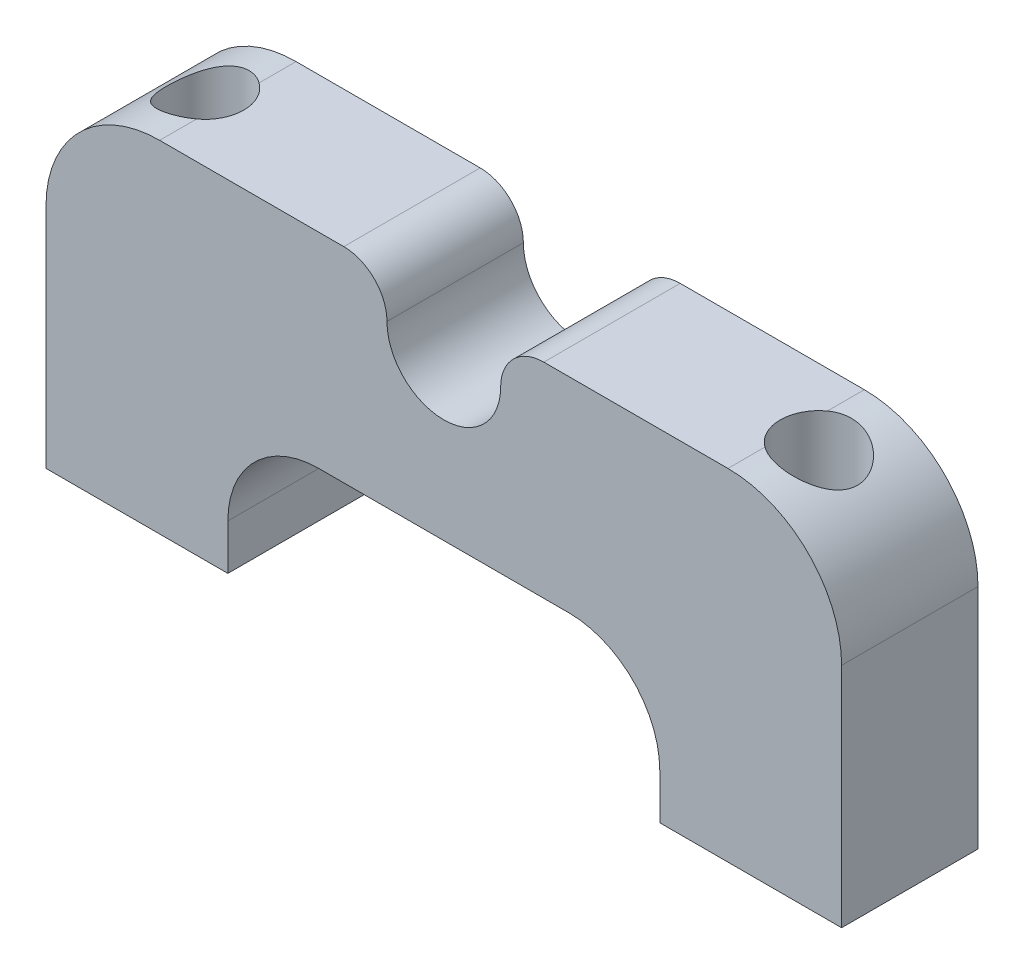
ISO-10303-21;
HEADER;
FILE_DESCRIPTION(('STEP AP214'),'2;1');
FILE_NAME('part.step','',(''),(''),'','','');
FILE_SCHEMA(('AUTOMOTIVE_DESIGN { 1 0 10303 214 1 1 1 1 }'));
ENDSEC;
DATA;
#1=APPLICATION_CONTEXT('core data for automotive mechanical design processes');
#2=APPLICATION_PROTOCOL_DEFINITION('international standard','automotive_design',2000,#1);
#3=PRODUCT_CONTEXT('',#1,'mechanical');
#4=PRODUCT('Part','Part','',(#3));
#5=PRODUCT_RELATED_PRODUCT_CATEGORY('part','',(#4));
#6=PRODUCT_DEFINITION_FORMATION('','',#4);
#7=PRODUCT_DEFINITION_CONTEXT('part definition',#1,'design');
#8=PRODUCT_DEFINITION('design','',#6,#7);
#9=PRODUCT_DEFINITION_SHAPE('','',#8);
#10=(LENGTH_UNIT() NAMED_UNIT(*) SI_UNIT(.MILLI.,.METRE.));
#11=(NAMED_UNIT(*) PLANE_ANGLE_UNIT() SI_UNIT($,.RADIAN.));
#12=(NAMED_UNIT(*) SI_UNIT($,.STERADIAN.) SOLID_ANGLE_UNIT());
#13=UNCERTAINTY_MEASURE_WITH_UNIT(LENGTH_MEASURE(1.E-05),#10,'distance_accuracy_value','');
#14=(GEOMETRIC_REPRESENTATION_CONTEXT(3) GLOBAL_UNCERTAINTY_ASSIGNED_CONTEXT((#13)) GLOBAL_UNIT_ASSIGNED_CONTEXT((#10,
#11,#12)) REPRESENTATION_CONTEXT('',''));
#15=CARTESIAN_POINT('',(0.,0.,0.));
#16=DIRECTION('',(0.,0.,1.));
#17=DIRECTION('',(1.,0.,0.));
#18=AXIS2_PLACEMENT_3D('',#15,#16,#17);
#19=CARTESIAN_POINT('',(8.75,-3.75,3.));
#20=DIRECTION('',(-1.,0.,0.));
#21=DIRECTION('',(0.,0.,1.));
#22=AXIS2_PLACEMENT_3D('',#19,#20,#21);
#23=PLANE('',#22);
#24=DIRECTION('',(0.,1.,0.));
#25=VECTOR('',#24,1.);
#26=CARTESIAN_POINT('',(8.75,-3.75,0.));
#27=LINE('',#26,#25);
#28=CARTESIAN_POINT('',(8.75,-3.75,0.));
#29=VERTEX_POINT('',#28);
#30=CARTESIAN_POINT('',(8.75,1.24999999999998,0.));
#31=VERTEX_POINT('',#30);
#32=EDGE_CURVE('E286',#29,#31,#27,.T.);
#33=ORIENTED_EDGE('',*,*,#32,.T.);
#34=DIRECTION('',(0.,0.,-1.));
#35=VECTOR('',#34,1.);
#36=CARTESIAN_POINT('',(8.75,1.24999999999998,3.));
#37=LINE('',#36,#35);
#38=CARTESIAN_POINT('',(8.75,1.24999999999998,3.));
#39=VERTEX_POINT('',#38);
#40=EDGE_CURVE('E200',#39,#31,#37,.T.);
#41=ORIENTED_EDGE('',*,*,#40,.F.);
#42=DIRECTION('',(0.,1.,0.));
#43=VECTOR('',#42,1.);
#44=CARTESIAN_POINT('',(8.75,-3.75,3.));
#45=LINE('',#44,#43);
#46=CARTESIAN_POINT('',(8.75,-3.75,3.));
#47=VERTEX_POINT('',#46);
#48=EDGE_CURVE('E329',#47,#39,#45,.T.);
#49=ORIENTED_EDGE('',*,*,#48,.F.);
#50=DIRECTION('',(0.,0.,-1.));
#51=VECTOR('',#50,1.);
#52=CARTESIAN_POINT('',(8.75,-3.75,3.));
#53=LINE('',#52,#51);
#54=EDGE_CURVE('E289',#47,#29,#53,.T.);
#55=ORIENTED_EDGE('',*,*,#54,.T.);
#56=EDGE_LOOP('',(#33,#41,#49,#55));
#57=FACE_BOUND('',#56,.T.);
#58=ADVANCED_FACE('F36',(#57),#23,.F.);
#59=CARTESIAN_POINT('',(6.25,1.25,3.));
#60=DIRECTION('',(0.,0.,-1.));
#61=DIRECTION('',(-1.,0.,0.));
#62=AXIS2_PLACEMENT_3D('',#59,#60,#61);
#63=CYLINDRICAL_SURFACE('',#62,2.5);
#64=DIRECTION('',(0.,0.,-1.));
#65=VECTOR('',#64,1.);
#66=CARTESIAN_POINT('',(6.24999999999998,3.75,3.));
#67=LINE('',#66,#65);
#68=CARTESIAN_POINT('',(6.25,3.75,0.812613645756626));
#69=VERTEX_POINT('',#68);
#70=CARTESIAN_POINT('',(6.24999999999998,3.75,0.));
#71=VERTEX_POINT('',#70);
#72=EDGE_CURVE('E196',#69,#71,#67,.T.);
#73=ORIENTED_EDGE('',*,*,#72,.F.);
#74=CARTESIAN_POINT('',(6.24999999999998,3.75,0.812613645756639));
#75=CARTESIAN_POINT('',(6.26860133412248,3.750000458947,0.799083008749802));
#76=CARTESIAN_POINT('',(6.28774447366208,3.74979206957645,0.78631399960251));
#77=CARTESIAN_POINT('',(6.32699426706544,3.74889125925356,0.762371939662228));
#78=CARTESIAN_POINT('',(6.34710097016077,3.7481988135446,0.751198970532428));
#79=CARTESIAN_POINT('',(6.40859391090567,3.74530012057646,0.720230178476046));
#80=CARTESIAN_POINT('',(6.45123506190468,3.74227309205735,0.702924914235687));
#81=CARTESIAN_POINT('',(6.53853853792758,3.73368127122221,0.675449657813136));
#82=CARTESIAN_POINT('',(6.58320286374509,3.72811391505039,0.66528690067766));
#83=CARTESIAN_POINT('',(6.67316989303669,3.71434501302801,0.652260791392417));
#84=CARTESIAN_POINT('',(6.71847240464708,3.7061442433805,0.649395290583925));
#85=CARTESIAN_POINT('',(6.80845830535242,3.68726084093931,0.650818034799965));
#86=CARTESIAN_POINT('',(6.85314129089804,3.67657666420299,0.655110740398517));
#87=CARTESIAN_POINT('',(6.94075669264475,3.65310531401902,0.670486686444462));
#88=CARTESIAN_POINT('',(6.98368823788299,3.64031710980484,0.681573262509686));
#89=CARTESIAN_POINT('',(7.06932880928035,3.61238156423578,0.710888589805132));
#90=CARTESIAN_POINT('',(7.11187571435693,3.59713962237322,0.729499637667582));
#91=CARTESIAN_POINT('',(7.1931250883493,3.56568914402077,0.773178182779638));
#92=CARTESIAN_POINT('',(7.23182606302024,3.54948023572287,0.798248176013787));
#93=CARTESIAN_POINT('',(7.30760560045878,3.51568444933086,0.856539775070852));
#94=CARTESIAN_POINT('',(7.34430342876685,3.49809157874233,0.890254778816378));
#95=CARTESIAN_POINT('',(7.41152811601018,3.46410788475755,0.96393235151555));
#96=CARTESIAN_POINT('',(7.44205174257271,3.44771769384524,1.00389817363914));
#97=CARTESIAN_POINT('',(7.49597349706725,3.41760393671702,1.08941367056501));
#98=CARTESIAN_POINT('',(7.51936090682466,3.40388439273398,1.13497160188311));
#99=CARTESIAN_POINT('',(7.55777445407831,3.38078284270151,1.23048597401679));
#100=CARTESIAN_POINT('',(7.57281483822758,3.37139345063459,1.28043475067022));
#101=CARTESIAN_POINT('',(7.59215594902143,3.35920144511412,1.37617081952253));
#102=CARTESIAN_POINT('',(7.59761495613544,3.35569133344911,1.42163349664168));
#103=CARTESIAN_POINT('',(7.60112606581426,3.35344122488716,1.51295285713064));
#104=CARTESIAN_POINT('',(7.59918269904735,3.35469831019603,1.55880928235985));
#105=CARTESIAN_POINT('',(7.58866455782104,3.36139927615017,1.64416007695867));
#106=CARTESIAN_POINT('',(7.58085661859316,3.36635863125548,1.68379191738784));
#107=CARTESIAN_POINT('',(7.55990347366423,3.37939055299157,1.76107471423333));
#108=CARTESIAN_POINT('',(7.54675697454936,3.38746387404296,1.79872518810998));
#109=CARTESIAN_POINT('',(7.51476885100089,3.40655361920219,1.87331794603312));
#110=CARTESIAN_POINT('',(7.49565265999665,3.41770802545482,1.91010612464368));
#111=CARTESIAN_POINT('',(7.45263585055003,3.44186573454314,1.98009631980471));
#112=CARTESIAN_POINT('',(7.42873291218911,3.45486993300018,2.01329658539767));
#113=CARTESIAN_POINT('',(7.37288031350231,3.48389050000698,2.0802471419617));
#114=CARTESIAN_POINT('',(7.34026574219057,3.50006973465675,2.11337339598548));
#115=CARTESIAN_POINT('',(7.27016403014479,3.53270934429794,2.17385064158631));
#116=CARTESIAN_POINT('',(7.23267394243239,3.54916988405311,2.20119811375466));
#117=CARTESIAN_POINT('',(7.14999135409407,3.58284751448357,2.2517019791982));
#118=CARTESIAN_POINT('',(7.10441036160618,3.6000016888383,2.27426930823073));
#119=CARTESIAN_POINT('',(7.00936157191337,3.63241208728115,2.31106473076521));
#120=CARTESIAN_POINT('',(6.95989476594483,3.64766879284794,2.32529494320761));
#121=CARTESIAN_POINT('',(6.86026613084888,3.67490094127643,2.34428599606073));
#122=CARTESIAN_POINT('',(6.81019328577165,3.68697466211033,2.34936900219388));
#123=CARTESIAN_POINT('',(6.7092839218702,3.70798869094631,2.35051941847204));
#124=CARTESIAN_POINT('',(6.65844774428526,3.71693035801989,2.34659074459636));
#125=CARTESIAN_POINT('',(6.56202351304686,3.73089114423223,2.33027562493094));
#126=CARTESIAN_POINT('',(6.51634893400191,3.73617335718952,2.31861496129235));
#127=CARTESIAN_POINT('',(6.42738619623757,3.7440976344157,2.28780011872209));
#128=CARTESIAN_POINT('',(6.3840951893759,3.74674291722218,2.26865511474758));
#129=CARTESIAN_POINT('',(6.32663462972008,3.74887758102337,2.23729199762628));
#130=CARTESIAN_POINT('',(6.31084411516351,3.74930764306688,2.22799626648231));
#131=CARTESIAN_POINT('',(6.27992335654751,3.74986841645679,2.2084215747894));
#132=CARTESIAN_POINT('',(6.26479185405823,3.7499997253082,2.19814461967824));
#133=CARTESIAN_POINT('',(6.24999999999998,3.75000000000001,2.18738635424337));
#134=B_SPLINE_CURVE_WITH_KNOTS('',3,(#74,#75,#76,#77,#78,#79,#80,#81,#82,#83,#84,#85,#86,#87,
#88,#89,#90,#91,#92,#93,#94,#95,#96,#97,#98,#99,#100,#101,#102,#103,#104,#105,#106,#107,#108,
#109,#110,#111,#112,#113,#114,#115,#116,#117,#118,#119,#120,#121,#122,#123,#124,#125,#126,#127,
#128,#129,#130,#131,#132,#133),.UNSPECIFIED.,.F.,.F.,(4,2,2,2,2,2,2,2,2,2,2,2,2,2,2,2,2,2,2,2,2,
2,2,2,2,2,2,2,2,4),(0.,0.0689655108109783,0.137934549057316,0.275572242505809,0.413349156739533,
0.551085498215195,0.688907700970909,0.826797625202506,0.972811254821336,1.1188813945704,
1.2766978680798,1.43459675043611,1.59273163327078,1.7505957757789,1.88755860908909,
2.02443762693215,2.14599123134418,2.26757430306655,2.39587602621132,2.52424008251001,
2.67129811573712,2.81844545413204,2.97867978970071,3.13887338282959,3.29330549445785,
3.447670511118,3.58927877713508,3.73071398902591,3.78566807732178,3.84051216071743),.UNSPECIFIED.);
#135=CARTESIAN_POINT('',(6.24999999999998,3.75,2.18738635424336));
#136=VERTEX_POINT('',#135);
#137=EDGE_CURVE('E48',#69,#136,#134,.T.);
#138=ORIENTED_EDGE('',*,*,#137,.T.);
#139=CARTESIAN_POINT('',(6.24999999999998,3.75,3.));
#140=VERTEX_POINT('',#139);
#141=EDGE_CURVE('E197',#140,#136,#67,.T.);
#142=ORIENTED_EDGE('',*,*,#141,.F.);
#143=CARTESIAN_POINT('',(6.25,1.25,3.));
#144=DIRECTION('',(0.,0.,1.));
#145=DIRECTION('',(1.,0.,0.));
#146=AXIS2_PLACEMENT_3D('',#143,#144,#145);
#147=CIRCLE('',#146,2.5);
#148=EDGE_CURVE('E383',#39,#140,#147,.T.);
#149=ORIENTED_EDGE('',*,*,#148,.F.);
#150=ORIENTED_EDGE('',*,*,#40,.T.);
#151=CARTESIAN_POINT('',(6.25,1.25,0.));
#152=DIRECTION('',(0.,0.,1.));
#153=DIRECTION('',(1.,0.,0.));
#154=AXIS2_PLACEMENT_3D('',#151,#152,#153);
#155=CIRCLE('',#154,2.5);
#156=EDGE_CURVE('E291',#31,#71,#155,.T.);
#157=ORIENTED_EDGE('',*,*,#156,.T.);
#158=EDGE_LOOP('',(#73,#138,#142,#149,#150,#157));
#159=FACE_BOUND('',#158,.T.);
#160=ADVANCED_FACE('F206',(#159),#63,.T.);
#161=CARTESIAN_POINT('',(6.24999999999998,3.75,3.));
#162=DIRECTION('',(0.,-1.,0.));
#163=DIRECTION('',(1.,0.,0.));
#164=AXIS2_PLACEMENT_3D('',#161,#162,#163);
#165=PLANE('',#164);
#166=ORIENTED_EDGE('',*,*,#141,.T.);
#167=CARTESIAN_POINT('',(6.75,3.75,1.5));
#168=DIRECTION('',(0.,-1.,0.));
#169=DIRECTION('',(0.,0.,-1.));
#170=AXIS2_PLACEMENT_3D('',#167,#168,#169);
#171=CIRCLE('',#170,0.849999999999998);
#172=EDGE_CURVE('E60',#136,#69,#171,.T.);
#173=ORIENTED_EDGE('',*,*,#172,.T.);
#174=ORIENTED_EDGE('',*,*,#72,.T.);
#175=DIRECTION('',(-1.,0.,0.));
#176=VECTOR('',#175,1.);
#177=CARTESIAN_POINT('',(6.24999999999998,3.75,0.));
#178=LINE('',#177,#176);
#179=CARTESIAN_POINT('',(2.2,3.75,0.));
#180=VERTEX_POINT('',#179);
#181=EDGE_CURVE('E294',#71,#180,#178,.T.);
#182=ORIENTED_EDGE('',*,*,#181,.T.);
#183=DIRECTION('',(0.,0.,-1.));
#184=VECTOR('',#183,1.);
#185=CARTESIAN_POINT('',(2.2,3.75,3.));
#186=LINE('',#185,#184);
#187=CARTESIAN_POINT('',(2.2,3.75,3.));
#188=VERTEX_POINT('',#187);
#189=EDGE_CURVE('E193',#188,#180,#186,.T.);
#190=ORIENTED_EDGE('',*,*,#189,.F.);
#191=DIRECTION('',(-1.,0.,0.));
#192=VECTOR('',#191,1.);
#193=CARTESIAN_POINT('',(6.24999999999998,3.75,3.));
#194=LINE('',#193,#192);
#195=EDGE_CURVE('E385',#140,#188,#194,.T.);
#196=ORIENTED_EDGE('',*,*,#195,.F.);
#197=EDGE_LOOP('',(#166,#173,#174,#182,#190,#196));
#198=FACE_BOUND('',#197,.T.);
#199=ADVANCED_FACE('F270',(#198),#165,.F.);
#200=CARTESIAN_POINT('',(2.2,2.8,3.));
#201=DIRECTION('',(0.,0.,-1.));
#202=DIRECTION('',(-1.,0.,0.));
#203=AXIS2_PLACEMENT_3D('',#200,#201,#202);
#204=CYLINDRICAL_SURFACE('',#203,0.95);
#205=CARTESIAN_POINT('',(2.2,2.8,0.));
#206=DIRECTION('',(0.,0.,1.));
#207=DIRECTION('',(-1.,0.,0.));
#208=AXIS2_PLACEMENT_3D('',#205,#206,#207);
#209=CIRCLE('',#208,0.95);
#210=CARTESIAN_POINT('',(1.25,2.8,0.));
#211=VERTEX_POINT('',#210);
#212=EDGE_CURVE('E303',#180,#211,#209,.T.);
#213=ORIENTED_EDGE('',*,*,#212,.T.);
#214=DIRECTION('',(0.,0.,-1.));
#215=VECTOR('',#214,1.);
#216=CARTESIAN_POINT('',(1.25,2.8,3.));
#217=LINE('',#216,#215);
#218=CARTESIAN_POINT('',(1.25,2.8,3.));
#219=VERTEX_POINT('',#218);
#220=EDGE_CURVE('E190',#219,#211,#217,.T.);
#221=ORIENTED_EDGE('',*,*,#220,.F.);
#222=CARTESIAN_POINT('',(2.2,2.8,3.));
#223=DIRECTION('',(0.,0.,1.));
#224=DIRECTION('',(-1.,0.,0.));
#225=AXIS2_PLACEMENT_3D('',#222,#223,#224);
#226=CIRCLE('',#225,0.95);
#227=EDGE_CURVE('E390',#188,#219,#226,.T.);
#228=ORIENTED_EDGE('',*,*,#227,.F.);
#229=ORIENTED_EDGE('',*,*,#189,.T.);
#230=EDGE_LOOP('',(#213,#221,#228,#229));
#231=FACE_BOUND('',#230,.T.);
#232=ADVANCED_FACE('F267',(#231),#204,.T.);
#233=CARTESIAN_POINT('',(0.,2.8,3.));
#234=DIRECTION('',(0.,0.,-1.));
#235=DIRECTION('',(-1.,0.,0.));
#236=AXIS2_PLACEMENT_3D('',#233,#234,#235);
#237=CYLINDRICAL_SURFACE('',#236,1.25);
#238=CARTESIAN_POINT('',(0.,2.8,0.));
#239=DIRECTION('',(0.,0.,-1.));
#240=DIRECTION('',(1.,0.,0.));
#241=AXIS2_PLACEMENT_3D('',#238,#239,#240);
#242=CIRCLE('',#241,1.25);
#243=CARTESIAN_POINT('',(-1.25,2.8,0.));
#244=VERTEX_POINT('',#243);
#245=EDGE_CURVE('E305',#211,#244,#242,.T.);
#246=ORIENTED_EDGE('',*,*,#245,.T.);
#247=DIRECTION('',(0.,0.,-1.));
#248=VECTOR('',#247,1.);
#249=CARTESIAN_POINT('',(-1.25,2.8,3.));
#250=LINE('',#249,#248);
#251=CARTESIAN_POINT('',(-1.25,2.8,3.));
#252=VERTEX_POINT('',#251);
#253=EDGE_CURVE('E182',#252,#244,#250,.T.);
#254=ORIENTED_EDGE('',*,*,#253,.F.);
#255=CARTESIAN_POINT('',(0.,2.8,3.));
#256=DIRECTION('',(0.,0.,-1.));
#257=DIRECTION('',(1.,0.,0.));
#258=AXIS2_PLACEMENT_3D('',#255,#256,#257);
#259=CIRCLE('',#258,1.25);
#260=EDGE_CURVE('E392',#219,#252,#259,.T.);
#261=ORIENTED_EDGE('',*,*,#260,.F.);
#262=ORIENTED_EDGE('',*,*,#220,.T.);
#263=EDGE_LOOP('',(#246,#254,#261,#262));
#264=FACE_BOUND('',#263,.T.);
#265=ADVANCED_FACE('F263',(#264),#237,.F.);
#266=CARTESIAN_POINT('',(-2.2,2.8,3.));
#267=DIRECTION('',(0.,0.,-1.));
#268=DIRECTION('',(-1.,0.,0.));
#269=AXIS2_PLACEMENT_3D('',#266,#267,#268);
#270=CYLINDRICAL_SURFACE('',#269,0.95);
#271=CARTESIAN_POINT('',(-2.2,2.8,0.));
#272=DIRECTION('',(0.,0.,1.));
#273=DIRECTION('',(1.,0.,0.));
#274=AXIS2_PLACEMENT_3D('',#271,#272,#273);
#275=CIRCLE('',#274,0.95);
#276=CARTESIAN_POINT('',(-2.2,3.75,0.));
#277=VERTEX_POINT('',#276);
#278=EDGE_CURVE('E307',#244,#277,#275,.T.);
#279=ORIENTED_EDGE('',*,*,#278,.T.);
#280=DIRECTION('',(0.,0.,-1.));
#281=VECTOR('',#280,1.);
#282=CARTESIAN_POINT('',(-2.2,3.75,3.));
#283=LINE('',#282,#281);
#284=CARTESIAN_POINT('',(-2.2,3.75,3.));
#285=VERTEX_POINT('',#284);
#286=EDGE_CURVE('E179',#285,#277,#283,.T.);
#287=ORIENTED_EDGE('',*,*,#286,.F.);
#288=CARTESIAN_POINT('',(-2.2,2.8,3.));
#289=DIRECTION('',(0.,0.,1.));
#290=DIRECTION('',(1.,0.,0.));
#291=AXIS2_PLACEMENT_3D('',#288,#289,#290);
#292=CIRCLE('',#291,0.95);
#293=EDGE_CURVE('E394',#252,#285,#292,.T.);
#294=ORIENTED_EDGE('',*,*,#293,.F.);
#295=ORIENTED_EDGE('',*,*,#253,.T.);
#296=EDGE_LOOP('',(#279,#287,#294,#295));
#297=FACE_BOUND('',#296,.T.);
#298=ADVANCED_FACE('F260',(#297),#270,.T.);
#299=CARTESIAN_POINT('',(-2.2,3.75,3.));
#300=DIRECTION('',(0.,-1.,0.));
#301=DIRECTION('',(1.,0.,0.));
#302=AXIS2_PLACEMENT_3D('',#299,#300,#301);
#303=PLANE('',#302);
#304=DIRECTION('',(0.,0.,-1.));
#305=VECTOR('',#304,1.);
#306=CARTESIAN_POINT('',(-6.24999999999998,3.75,3.));
#307=LINE('',#306,#305);
#308=CARTESIAN_POINT('',(-6.24999999999998,3.75,0.812613645756639));
#309=VERTEX_POINT('',#308);
#310=CARTESIAN_POINT('',(-6.24999999999998,3.75,0.));
#311=VERTEX_POINT('',#310);
#312=EDGE_CURVE('E172',#309,#311,#307,.T.);
#313=ORIENTED_EDGE('',*,*,#312,.F.);
#314=CARTESIAN_POINT('',(-6.75,3.75,1.5));
#315=DIRECTION('',(0.,-1.,0.));
#316=DIRECTION('',(0.,0.,-1.));
#317=AXIS2_PLACEMENT_3D('',#314,#315,#316);
#318=CIRCLE('',#317,0.849999999999998);
#319=CARTESIAN_POINT('',(-6.25,3.75,2.18738635424337));
#320=VERTEX_POINT('',#319);
#321=EDGE_CURVE('E54',#309,#320,#318,.T.);
#322=ORIENTED_EDGE('',*,*,#321,.T.);
#323=CARTESIAN_POINT('',(-6.24999999999998,3.75,3.));
#324=VERTEX_POINT('',#323);
#325=EDGE_CURVE('E169',#324,#320,#307,.T.);
#326=ORIENTED_EDGE('',*,*,#325,.F.);
#327=DIRECTION('',(-1.,0.,0.));
#328=VECTOR('',#327,1.);
#329=CARTESIAN_POINT('',(-2.2,3.75,3.));
#330=LINE('',#329,#328);
#331=EDGE_CURVE('E396',#285,#324,#330,.T.);
#332=ORIENTED_EDGE('',*,*,#331,.F.);
#333=ORIENTED_EDGE('',*,*,#286,.T.);
#334=DIRECTION('',(-1.,0.,0.));
#335=VECTOR('',#334,1.);
#336=CARTESIAN_POINT('',(-2.2,3.75,0.));
#337=LINE('',#336,#335);
#338=EDGE_CURVE('E309',#277,#311,#337,.T.);
#339=ORIENTED_EDGE('',*,*,#338,.T.);
#340=EDGE_LOOP('',(#313,#322,#326,#332,#333,#339));
#341=FACE_BOUND('',#340,.T.);
#342=ADVANCED_FACE('F167',(#341),#303,.F.);
#343=CARTESIAN_POINT('',(-6.25,1.25,3.));
#344=DIRECTION('',(0.,0.,-1.));
#345=DIRECTION('',(-1.,0.,0.));
#346=AXIS2_PLACEMENT_3D('',#343,#344,#345);
#347=CYLINDRICAL_SURFACE('',#346,2.5);
#348=ORIENTED_EDGE('',*,*,#325,.T.);
#349=CARTESIAN_POINT('',(-6.24999999999998,3.75,2.18738635424336));
#350=CARTESIAN_POINT('',(-6.26860133412247,3.75000045894699,2.2009169912502));
#351=CARTESIAN_POINT('',(-6.28774447366208,3.74979206957645,2.21368600039749));
#352=CARTESIAN_POINT('',(-6.32699426706544,3.74889125925355,2.23762806033777));
#353=CARTESIAN_POINT('',(-6.34710097016077,3.74819881354459,2.24880102946757));
#354=CARTESIAN_POINT('',(-6.40859391090566,3.74530012057645,2.27976982152395));
#355=CARTESIAN_POINT('',(-6.45123506190468,3.74227309205735,2.29707508576431));
#356=CARTESIAN_POINT('',(-6.53853853792758,3.73368127122221,2.32455034218686));
#357=CARTESIAN_POINT('',(-6.58320286374509,3.72811391505039,2.33471309932234));
#358=CARTESIAN_POINT('',(-6.67316989303668,3.71434501302801,2.34773920860758));
#359=CARTESIAN_POINT('',(-6.71847240464707,3.7061442433805,2.35060470941607));
#360=CARTESIAN_POINT('',(-6.80845830535242,3.68726084093931,2.34918196520004));
#361=CARTESIAN_POINT('',(-6.85314129089804,3.67657666420299,2.34488925960148));
#362=CARTESIAN_POINT('',(-6.94075669264475,3.65310531401902,2.32951331355554));
#363=CARTESIAN_POINT('',(-6.98368823788298,3.64031710980484,2.31842673749031));
#364=CARTESIAN_POINT('',(-7.06932880928034,3.61238156423578,2.28911141019487));
#365=CARTESIAN_POINT('',(-7.11187571435693,3.59713962237322,2.27050036233242));
#366=CARTESIAN_POINT('',(-7.19312508834929,3.56568914402077,2.22682181722036));
#367=CARTESIAN_POINT('',(-7.23182606302024,3.54948023572287,2.20175182398621));
#368=CARTESIAN_POINT('',(-7.30760560045877,3.51568444933086,2.14346022492915));
#369=CARTESIAN_POINT('',(-7.34430342876685,3.49809157874233,2.10974522118362));
#370=CARTESIAN_POINT('',(-7.41152811601018,3.46410788475755,2.03606764848445));
#371=CARTESIAN_POINT('',(-7.44205174257271,3.44771769384524,1.99610182636086));
#372=CARTESIAN_POINT('',(-7.49597349706725,3.41760393671702,1.91058632943499));
#373=CARTESIAN_POINT('',(-7.51936090682465,3.40388439273397,1.86502839811689));
#374=CARTESIAN_POINT('',(-7.55777445407831,3.38078284270151,1.76951402598321));
#375=CARTESIAN_POINT('',(-7.57281483822758,3.37139345063459,1.71956524932978));
#376=CARTESIAN_POINT('',(-7.59215594902142,3.35920144511412,1.62382918047747));
#377=CARTESIAN_POINT('',(-7.59761495613544,3.35569133344911,1.57836650335832));
#378=CARTESIAN_POINT('',(-7.60112606581426,3.35344122488716,1.48704714286936));
#379=CARTESIAN_POINT('',(-7.59918269904735,3.35469831019602,1.44119071764015));
#380=CARTESIAN_POINT('',(-7.58866455782104,3.36139927615017,1.35583992304133));
#381=CARTESIAN_POINT('',(-7.58085661859316,3.36635863125547,1.31620808261216));
#382=CARTESIAN_POINT('',(-7.55990347366422,3.37939055299157,1.23892528576667));
#383=CARTESIAN_POINT('',(-7.54675697454935,3.38746387404295,1.20127481189002));
#384=CARTESIAN_POINT('',(-7.51476885100089,3.40655361920219,1.12668205396688));
#385=CARTESIAN_POINT('',(-7.49565265999664,3.41770802545482,1.08989387535632));
#386=CARTESIAN_POINT('',(-7.45263585055003,3.44186573454314,1.01990368019529));
#387=CARTESIAN_POINT('',(-7.42873291218911,3.45486993300018,0.986703414602327));
#388=CARTESIAN_POINT('',(-7.3728803135023,3.48389050000697,0.919752858038296));
#389=CARTESIAN_POINT('',(-7.34026574219057,3.50006973465675,0.886626604014523));
#390=CARTESIAN_POINT('',(-7.27016403014479,3.53270934429794,0.826149358413693));
#391=CARTESIAN_POINT('',(-7.23267394243239,3.54916988405311,0.798801886245336));
#392=CARTESIAN_POINT('',(-7.14999135409406,3.58284751448356,0.748298020801804));
#393=CARTESIAN_POINT('',(-7.10441036160618,3.6000016888383,0.725730691769272));
#394=CARTESIAN_POINT('',(-7.00936157191337,3.63241208728115,0.688935269234792));
#395=CARTESIAN_POINT('',(-6.95989476594482,3.64766879284794,0.674705056792392));
#396=CARTESIAN_POINT('',(-6.86026613084888,3.67490094127643,0.655714003939276));
#397=CARTESIAN_POINT('',(-6.81019328577165,3.68697466211033,0.650630997806122));
#398=CARTESIAN_POINT('',(-6.7092839218702,3.70798869094631,0.649480581527961));
#399=CARTESIAN_POINT('',(-6.65844774428526,3.71693035801989,0.65340925540364));
#400=CARTESIAN_POINT('',(-6.56202351304686,3.73089114423223,0.669724375069062));
#401=CARTESIAN_POINT('',(-6.51634893400191,3.73617335718952,0.681385038707654));
#402=CARTESIAN_POINT('',(-6.42738619623757,3.7440976344157,0.712199881277908));
#403=CARTESIAN_POINT('',(-6.3840951893759,3.74674291722218,0.73134488525242));
#404=CARTESIAN_POINT('',(-6.32663462972008,3.74887758102337,0.762708002373722));
#405=CARTESIAN_POINT('',(-6.31084411516351,3.74930764306688,0.772003733517694));
#406=CARTESIAN_POINT('',(-6.2799233565475,3.74986841645679,0.7915784252106));
#407=CARTESIAN_POINT('',(-6.26479185405822,3.7499997253082,0.801855380321764));
#408=CARTESIAN_POINT('',(-6.24999999999998,3.75000000000001,0.812613645756628));
#409=B_SPLINE_CURVE_WITH_KNOTS('',3,(#349,#350,#351,#352,#353,#354,#355,#356,#357,#358,#359,
#360,#361,#362,#363,#364,#365,#366,#367,#368,#369,#370,#371,#372,#373,#374,#375,#376,#377,#378,
#379,#380,#381,#382,#383,#384,#385,#386,#387,#388,#389,#390,#391,#392,#393,#394,#395,#396,#397,
#398,#399,#400,#401,#402,#403,#404,#405,#406,#407,#408),.UNSPECIFIED.,.F.,.F.,(4,2,2,2,2,2,2,2,
2,2,2,2,2,2,2,2,2,2,2,2,2,2,2,2,2,2,2,2,2,4),(0.,0.0689655108109783,0.137934549057316,
0.275572242505809,0.413349156739531,0.551085498215194,0.688907700970907,0.826797625202505,
0.972811254821336,1.1188813945704,1.2766978680798,1.4345967504361,1.59273163327078,
1.7505957757789,1.88755860908909,2.02443762693215,2.14599123134418,2.26757430306655,
2.39587602621132,2.52424008251001,2.67129811573712,2.81844545413204,2.97867978970071,
3.13887338282959,3.29330549445784,3.447670511118,3.58927877713508,3.73071398902591,
3.78566807732178,3.84051216071743),.UNSPECIFIED.);
#410=EDGE_CURVE('E11',#320,#309,#409,.T.);
#411=ORIENTED_EDGE('',*,*,#410,.T.);
#412=ORIENTED_EDGE('',*,*,#312,.T.);
#413=CARTESIAN_POINT('',(-6.25,1.25,0.));
#414=DIRECTION('',(0.,0.,1.));
#415=DIRECTION('',(1.,0.,0.));
#416=AXIS2_PLACEMENT_3D('',#413,#414,#415);
#417=CIRCLE('',#416,2.5);
#418=CARTESIAN_POINT('',(-8.75,1.24999999999998,0.));
#419=VERTEX_POINT('',#418);
#420=EDGE_CURVE('E311',#311,#419,#417,.T.);
#421=ORIENTED_EDGE('',*,*,#420,.T.);
#422=DIRECTION('',(0.,0.,-1.));
#423=VECTOR('',#422,1.);
#424=CARTESIAN_POINT('',(-8.75,1.24999999999998,3.));
#425=LINE('',#424,#423);
#426=CARTESIAN_POINT('',(-8.75,1.24999999999998,3.));
#427=VERTEX_POINT('',#426);
#428=EDGE_CURVE('E184',#427,#419,#425,.T.);
#429=ORIENTED_EDGE('',*,*,#428,.F.);
#430=CARTESIAN_POINT('',(-6.25,1.25,3.));
#431=DIRECTION('',(0.,0.,1.));
#432=DIRECTION('',(1.,0.,0.));
#433=AXIS2_PLACEMENT_3D('',#430,#431,#432);
#434=CIRCLE('',#433,2.5);
#435=EDGE_CURVE('E178',#324,#427,#434,.T.);
#436=ORIENTED_EDGE('',*,*,#435,.F.);
#437=EDGE_LOOP('',(#348,#411,#412,#421,#429,#436));
#438=FACE_BOUND('',#437,.T.);
#439=ADVANCED_FACE('F176',(#438),#347,.T.);
#440=CARTESIAN_POINT('',(-8.75,-3.75,3.));
#441=DIRECTION('',(1.,0.,0.));
#442=DIRECTION('',(0.,0.,-1.));
#443=AXIS2_PLACEMENT_3D('',#440,#441,#442);
#444=PLANE('',#443);
#445=DIRECTION('',(0.,-1.,0.));
#446=VECTOR('',#445,1.);
#447=CARTESIAN_POINT('',(-8.75,-3.75,0.));
#448=LINE('',#447,#446);
#449=CARTESIAN_POINT('',(-8.75,-3.75,0.));
#450=VERTEX_POINT('',#449);
#451=EDGE_CURVE('E313',#419,#450,#448,.T.);
#452=ORIENTED_EDGE('',*,*,#451,.T.);
#453=DIRECTION('',(0.,0.,-1.));
#454=VECTOR('',#453,1.);
#455=CARTESIAN_POINT('',(-8.75,-3.75,3.));
#456=LINE('',#455,#454);
#457=CARTESIAN_POINT('',(-8.75,-3.75,3.));
#458=VERTEX_POINT('',#457);
#459=EDGE_CURVE('E348',#458,#450,#456,.T.);
#460=ORIENTED_EDGE('',*,*,#459,.F.);
#461=DIRECTION('',(0.,-1.,0.));
#462=VECTOR('',#461,1.);
#463=CARTESIAN_POINT('',(-8.75,-3.75,3.));
#464=LINE('',#463,#462);
#465=EDGE_CURVE('E357',#427,#458,#464,.T.);
#466=ORIENTED_EDGE('',*,*,#465,.F.);
#467=ORIENTED_EDGE('',*,*,#428,.T.);
#468=EDGE_LOOP('',(#452,#460,#466,#467));
#469=FACE_BOUND('',#468,.T.);
#470=ADVANCED_FACE('F251',(#469),#444,.F.);
#471=CARTESIAN_POINT('',(-4.75,-3.75,3.));
#472=DIRECTION('',(0.,1.,0.));
#473=DIRECTION('',(0.,0.,1.));
#474=AXIS2_PLACEMENT_3D('',#471,#472,#473);
#475=PLANE('',#474);
#476=CARTESIAN_POINT('',(-6.75,-3.75,1.5));
#477=DIRECTION('',(0.,-1.,0.));
#478=DIRECTION('',(0.,0.,-1.));
#479=AXIS2_PLACEMENT_3D('',#476,#477,#478);
#480=CIRCLE('',#479,1.);
#481=CARTESIAN_POINT('',(-6.75,-3.75,0.5));
#482=VERTEX_POINT('',#481);
#483=EDGE_CURVE('E418',#482,#482,#480,.T.);
#484=ORIENTED_EDGE('',*,*,#483,.F.);
#485=EDGE_LOOP('',(#484));
#486=FACE_BOUND('',#485,.T.);
#487=DIRECTION('',(1.,0.,0.));
#488=VECTOR('',#487,1.);
#489=CARTESIAN_POINT('',(-4.75,-3.75,0.));
#490=LINE('',#489,#488);
#491=CARTESIAN_POINT('',(-4.75,-3.75,0.));
#492=VERTEX_POINT('',#491);
#493=EDGE_CURVE('E315',#450,#492,#490,.T.);
#494=ORIENTED_EDGE('',*,*,#493,.T.);
#495=DIRECTION('',(0.,0.,-1.));
#496=VECTOR('',#495,1.);
#497=CARTESIAN_POINT('',(-4.75,-3.75,3.));
#498=LINE('',#497,#496);
#499=CARTESIAN_POINT('',(-4.75,-3.75,3.));
#500=VERTEX_POINT('',#499);
#501=EDGE_CURVE('E346',#500,#492,#498,.T.);
#502=ORIENTED_EDGE('',*,*,#501,.F.);
#503=DIRECTION('',(1.,0.,0.));
#504=VECTOR('',#503,1.);
#505=CARTESIAN_POINT('',(-4.75,-3.75,3.));
#506=LINE('',#505,#504);
#507=EDGE_CURVE('E368',#458,#500,#506,.T.);
#508=ORIENTED_EDGE('',*,*,#507,.F.);
#509=ORIENTED_EDGE('',*,*,#459,.T.);
#510=EDGE_LOOP('',(#494,#502,#508,#509));
#511=FACE_BOUND('',#510,.T.);
#512=ADVANCED_FACE('F247',(#486,#511),#475,.F.);
#513=CARTESIAN_POINT('',(-4.75,-3.75,3.));
#514=DIRECTION('',(-1.,0.,0.));
#515=DIRECTION('',(0.,0.,1.));
#516=AXIS2_PLACEMENT_3D('',#513,#514,#515);
#517=PLANE('',#516);
#518=DIRECTION('',(0.,1.,0.));
#519=VECTOR('',#518,1.);
#520=CARTESIAN_POINT('',(-4.75,-3.75,0.));
#521=LINE('',#520,#519);
#522=CARTESIAN_POINT('',(-4.75,-2.75,0.));
#523=VERTEX_POINT('',#522);
#524=EDGE_CURVE('E317',#492,#523,#521,.T.);
#525=ORIENTED_EDGE('',*,*,#524,.T.);
#526=DIRECTION('',(0.,0.,-1.));
#527=VECTOR('',#526,1.);
#528=CARTESIAN_POINT('',(-4.75,-2.75,3.));
#529=LINE('',#528,#527);
#530=CARTESIAN_POINT('',(-4.75,-2.75,3.));
#531=VERTEX_POINT('',#530);
#532=EDGE_CURVE('E343',#531,#523,#529,.T.);
#533=ORIENTED_EDGE('',*,*,#532,.F.);
#534=DIRECTION('',(0.,1.,0.));
#535=VECTOR('',#534,1.);
#536=CARTESIAN_POINT('',(-4.75,-3.75,3.));
#537=LINE('',#536,#535);
#538=EDGE_CURVE('E365',#500,#531,#537,.T.);
#539=ORIENTED_EDGE('',*,*,#538,.F.);
#540=ORIENTED_EDGE('',*,*,#501,.T.);
#541=EDGE_LOOP('',(#525,#533,#539,#540));
#542=FACE_BOUND('',#541,.T.);
#543=ADVANCED_FACE('F243',(#542),#517,.F.);
#544=CARTESIAN_POINT('',(-2.75,-2.75,3.));
#545=DIRECTION('',(0.,0.,-1.));
#546=DIRECTION('',(-1.,0.,0.));
#547=AXIS2_PLACEMENT_3D('',#544,#545,#546);
#548=CYLINDRICAL_SURFACE('',#547,2.);
#549=CARTESIAN_POINT('',(-2.75,-2.75,0.));
#550=DIRECTION('',(0.,0.,-1.));
#551=DIRECTION('',(1.,0.,0.));
#552=AXIS2_PLACEMENT_3D('',#549,#550,#551);
#553=CIRCLE('',#552,2.);
#554=CARTESIAN_POINT('',(-2.75,-0.750000000000001,0.));
#555=VERTEX_POINT('',#554);
#556=EDGE_CURVE('E319',#523,#555,#553,.T.);
#557=ORIENTED_EDGE('',*,*,#556,.T.);
#558=DIRECTION('',(0.,0.,-1.));
#559=VECTOR('',#558,1.);
#560=CARTESIAN_POINT('',(-2.75,-0.750000000000001,3.));
#561=LINE('',#560,#559);
#562=CARTESIAN_POINT('',(-2.75,-0.750000000000001,3.));
#563=VERTEX_POINT('',#562);
#564=EDGE_CURVE('E340',#563,#555,#561,.T.);
#565=ORIENTED_EDGE('',*,*,#564,.F.);
#566=CARTESIAN_POINT('',(-2.75,-2.75,3.));
#567=DIRECTION('',(0.,0.,-1.));
#568=DIRECTION('',(1.,0.,0.));
#569=AXIS2_PLACEMENT_3D('',#566,#567,#568);
#570=CIRCLE('',#569,2.);
#571=EDGE_CURVE('E367',#531,#563,#570,.T.);
#572=ORIENTED_EDGE('',*,*,#571,.F.);
#573=ORIENTED_EDGE('',*,*,#532,.T.);
#574=EDGE_LOOP('',(#557,#565,#572,#573));
#575=FACE_BOUND('',#574,.T.);
#576=ADVANCED_FACE('F239',(#575),#548,.F.);
#577=CARTESIAN_POINT('',(-2.75,-0.750000000000001,3.));
#578=DIRECTION('',(0.,1.,0.));
#579=DIRECTION('',(0.,0.,1.));
#580=AXIS2_PLACEMENT_3D('',#577,#578,#579);
#581=PLANE('',#580);
#582=DIRECTION('',(1.,0.,0.));
#583=VECTOR('',#582,1.);
#584=CARTESIAN_POINT('',(-2.75,-0.750000000000001,0.));
#585=LINE('',#584,#583);
#586=CARTESIAN_POINT('',(2.75,-0.750000000000001,0.));
#587=VERTEX_POINT('',#586);
#588=EDGE_CURVE('E321',#555,#587,#585,.T.);
#589=ORIENTED_EDGE('',*,*,#588,.T.);
#590=DIRECTION('',(0.,0.,-1.));
#591=VECTOR('',#590,1.);
#592=CARTESIAN_POINT('',(2.75,-0.750000000000001,3.));
#593=LINE('',#592,#591);
#594=CARTESIAN_POINT('',(2.75,-0.750000000000001,3.));
#595=VERTEX_POINT('',#594);
#596=EDGE_CURVE('E337',#595,#587,#593,.T.);
#597=ORIENTED_EDGE('',*,*,#596,.F.);
#598=DIRECTION('',(1.,0.,0.));
#599=VECTOR('',#598,1.);
#600=CARTESIAN_POINT('',(-2.75,-0.750000000000001,3.));
#601=LINE('',#600,#599);
#602=EDGE_CURVE('E370',#563,#595,#601,.T.);
#603=ORIENTED_EDGE('',*,*,#602,.F.);
#604=ORIENTED_EDGE('',*,*,#564,.T.);
#605=EDGE_LOOP('',(#589,#597,#603,#604));
#606=FACE_BOUND('',#605,.T.);
#607=ADVANCED_FACE('F235',(#606),#581,.F.);
#608=CARTESIAN_POINT('',(2.75,-2.75,3.));
#609=DIRECTION('',(0.,0.,-1.));
#610=DIRECTION('',(-1.,0.,0.));
#611=AXIS2_PLACEMENT_3D('',#608,#609,#610);
#612=CYLINDRICAL_SURFACE('',#611,2.);
#613=CARTESIAN_POINT('',(2.75,-2.75,0.));
#614=DIRECTION('',(0.,0.,-1.));
#615=DIRECTION('',(-1.,0.,0.));
#616=AXIS2_PLACEMENT_3D('',#613,#614,#615);
#617=CIRCLE('',#616,2.);
#618=CARTESIAN_POINT('',(4.75,-2.75,0.));
#619=VERTEX_POINT('',#618);
#620=EDGE_CURVE('E323',#587,#619,#617,.T.);
#621=ORIENTED_EDGE('',*,*,#620,.T.);
#622=DIRECTION('',(0.,0.,-1.));
#623=VECTOR('',#622,1.);
#624=CARTESIAN_POINT('',(4.75,-2.75,3.));
#625=LINE('',#624,#623);
#626=CARTESIAN_POINT('',(4.75,-2.75,3.));
#627=VERTEX_POINT('',#626);
#628=EDGE_CURVE('E334',#627,#619,#625,.T.);
#629=ORIENTED_EDGE('',*,*,#628,.F.);
#630=CARTESIAN_POINT('',(2.75,-2.75,3.));
#631=DIRECTION('',(0.,0.,-1.));
#632=DIRECTION('',(-1.,0.,0.));
#633=AXIS2_PLACEMENT_3D('',#630,#631,#632);
#634=CIRCLE('',#633,2.);
#635=EDGE_CURVE('E376',#595,#627,#634,.T.);
#636=ORIENTED_EDGE('',*,*,#635,.F.);
#637=ORIENTED_EDGE('',*,*,#596,.T.);
#638=EDGE_LOOP('',(#621,#629,#636,#637));
#639=FACE_BOUND('',#638,.T.);
#640=ADVANCED_FACE('F231',(#639),#612,.F.);
#641=CARTESIAN_POINT('',(4.75,-3.75,3.));
#642=DIRECTION('',(1.,0.,0.));
#643=DIRECTION('',(0.,0.,-1.));
#644=AXIS2_PLACEMENT_3D('',#641,#642,#643);
#645=PLANE('',#644);
#646=DIRECTION('',(0.,-1.,0.));
#647=VECTOR('',#646,1.);
#648=CARTESIAN_POINT('',(4.75,-3.75,0.));
#649=LINE('',#648,#647);
#650=CARTESIAN_POINT('',(4.75,-3.75,0.));
#651=VERTEX_POINT('',#650);
#652=EDGE_CURVE('E325',#619,#651,#649,.T.);
#653=ORIENTED_EDGE('',*,*,#652,.T.);
#654=DIRECTION('',(0.,0.,-1.));
#655=VECTOR('',#654,1.);
#656=CARTESIAN_POINT('',(4.75,-3.75,3.));
#657=LINE('',#656,#655);
#658=CARTESIAN_POINT('',(4.75,-3.75,3.));
#659=VERTEX_POINT('',#658);
#660=EDGE_CURVE('E331',#659,#651,#657,.T.);
#661=ORIENTED_EDGE('',*,*,#660,.F.);
#662=DIRECTION('',(0.,-1.,0.));
#663=VECTOR('',#662,1.);
#664=CARTESIAN_POINT('',(4.75,-3.75,3.));
#665=LINE('',#664,#663);
#666=EDGE_CURVE('E377',#627,#659,#665,.T.);
#667=ORIENTED_EDGE('',*,*,#666,.F.);
#668=ORIENTED_EDGE('',*,*,#628,.T.);
#669=EDGE_LOOP('',(#653,#661,#667,#668));
#670=FACE_BOUND('',#669,.T.);
#671=ADVANCED_FACE('F227',(#670),#645,.F.);
#672=CARTESIAN_POINT('',(8.75,-3.75,3.));
#673=DIRECTION('',(0.,1.,0.));
#674=DIRECTION('',(-1.,0.,0.));
#675=AXIS2_PLACEMENT_3D('',#672,#673,#674);
#676=PLANE('',#675);
#677=CARTESIAN_POINT('',(6.75,-3.75,1.5));
#678=DIRECTION('',(0.,-1.,0.));
#679=DIRECTION('',(0.,0.,-1.));
#680=AXIS2_PLACEMENT_3D('',#677,#678,#679);
#681=CIRCLE('',#680,1.);
#682=CARTESIAN_POINT('',(6.75,-3.75,0.5));
#683=VERTEX_POINT('',#682);
#684=EDGE_CURVE('E173',#683,#683,#681,.T.);
#685=ORIENTED_EDGE('',*,*,#684,.F.);
#686=EDGE_LOOP('',(#685));
#687=FACE_BOUND('',#686,.T.);
#688=DIRECTION('',(1.,0.,0.));
#689=VECTOR('',#688,1.);
#690=CARTESIAN_POINT('',(8.75,-3.75,0.));
#691=LINE('',#690,#689);
#692=EDGE_CURVE('E327',#651,#29,#691,.T.);
#693=ORIENTED_EDGE('',*,*,#692,.T.);
#694=ORIENTED_EDGE('',*,*,#54,.F.);
#695=DIRECTION('',(1.,0.,0.));
#696=VECTOR('',#695,1.);
#697=CARTESIAN_POINT('',(8.75,-3.75,3.));
#698=LINE('',#697,#696);
#699=EDGE_CURVE('E299',#659,#47,#698,.T.);
#700=ORIENTED_EDGE('',*,*,#699,.F.);
#701=ORIENTED_EDGE('',*,*,#660,.T.);
#702=EDGE_LOOP('',(#693,#694,#700,#701));
#703=FACE_BOUND('',#702,.T.);
#704=ADVANCED_FACE('F220',(#687,#703),#676,.F.);
#705=CARTESIAN_POINT('',(6.25,1.25,3.));
#706=DIRECTION('',(0.,0.,1.));
#707=DIRECTION('',(1.,0.,0.));
#708=AXIS2_PLACEMENT_3D('',#705,#706,#707);
#709=PLANE('',#708);
#710=ORIENTED_EDGE('',*,*,#48,.T.);
#711=ORIENTED_EDGE('',*,*,#148,.T.);
#712=ORIENTED_EDGE('',*,*,#195,.T.);
#713=ORIENTED_EDGE('',*,*,#227,.T.);
#714=ORIENTED_EDGE('',*,*,#260,.T.);
#715=ORIENTED_EDGE('',*,*,#293,.T.);
#716=ORIENTED_EDGE('',*,*,#331,.T.);
#717=ORIENTED_EDGE('',*,*,#435,.T.);
#718=ORIENTED_EDGE('',*,*,#465,.T.);
#719=ORIENTED_EDGE('',*,*,#507,.T.);
#720=ORIENTED_EDGE('',*,*,#538,.T.);
#721=ORIENTED_EDGE('',*,*,#571,.T.);
#722=ORIENTED_EDGE('',*,*,#602,.T.);
#723=ORIENTED_EDGE('',*,*,#635,.T.);
#724=ORIENTED_EDGE('',*,*,#666,.T.);
#725=ORIENTED_EDGE('',*,*,#699,.T.);
#726=EDGE_LOOP('',(#710,#711,#712,#713,#714,#715,#716,#717,#718,#719,#720,#721,#722,#723,#724,#725));
#727=FACE_BOUND('',#726,.T.);
#728=ADVANCED_FACE('F217',(#727),#709,.T.);
#729=CARTESIAN_POINT('',(6.25,1.25,0.));
#730=DIRECTION('',(0.,0.,1.));
#731=DIRECTION('',(1.,0.,0.));
#732=AXIS2_PLACEMENT_3D('',#729,#730,#731);
#733=PLANE('',#732);
#734=ORIENTED_EDGE('',*,*,#32,.F.);
#735=ORIENTED_EDGE('',*,*,#692,.F.);
#736=ORIENTED_EDGE('',*,*,#652,.F.);
#737=ORIENTED_EDGE('',*,*,#620,.F.);
#738=ORIENTED_EDGE('',*,*,#588,.F.);
#739=ORIENTED_EDGE('',*,*,#556,.F.);
#740=ORIENTED_EDGE('',*,*,#524,.F.);
#741=ORIENTED_EDGE('',*,*,#493,.F.);
#742=ORIENTED_EDGE('',*,*,#451,.F.);
#743=ORIENTED_EDGE('',*,*,#420,.F.);
#744=ORIENTED_EDGE('',*,*,#338,.F.);
#745=ORIENTED_EDGE('',*,*,#278,.F.);
#746=ORIENTED_EDGE('',*,*,#245,.F.);
#747=ORIENTED_EDGE('',*,*,#212,.F.);
#748=ORIENTED_EDGE('',*,*,#181,.F.);
#749=ORIENTED_EDGE('',*,*,#156,.F.);
#750=EDGE_LOOP('',(#734,#735,#736,#737,#738,#739,#740,#741,#742,#743,#744,#745,#746,#747,#748,#749));
#751=FACE_BOUND('',#750,.T.);
#752=ADVANCED_FACE('F215',(#751),#733,.F.);
#753=CARTESIAN_POINT('',(6.75,-3.75,1.5));
#754=DIRECTION('',(0.,-1.,0.));
#755=DIRECTION('',(0.,0.,-1.));
#756=AXIS2_PLACEMENT_3D('',#753,#754,#755);
#757=CYLINDRICAL_SURFACE('',#756,0.849999999999999);
#758=CARTESIAN_POINT('',(6.75,-3.6,1.5));
#759=DIRECTION('',(0.,-1.,0.));
#760=DIRECTION('',(0.,0.,-1.));
#761=AXIS2_PLACEMENT_3D('',#758,#759,#760);
#762=CIRCLE('',#761,0.849999999999999);
#763=CARTESIAN_POINT('',(6.75,-3.6,0.650000000000001));
#764=VERTEX_POINT('',#763);
#765=EDGE_CURVE('E296',#764,#764,#762,.T.);
#766=ORIENTED_EDGE('',*,*,#765,.T.);
#767=EDGE_LOOP('',(#766));
#768=FACE_BOUND('',#767,.T.);
#769=ORIENTED_EDGE('',*,*,#172,.F.);
#770=ORIENTED_EDGE('',*,*,#137,.F.);
#771=EDGE_LOOP('',(#769,#770));
#772=FACE_BOUND('',#771,.T.);
#773=ADVANCED_FACE('F209',(#768,#772),#757,.F.);
#774=CARTESIAN_POINT('',(6.75,-3.75,1.5));
#775=DIRECTION('',(0.,-1.,0.));
#776=DIRECTION('',(0.,0.,-1.));
#777=AXIS2_PLACEMENT_3D('',#774,#775,#776);
#778=CONICAL_SURFACE('',#777,1.,0.785398163397451);
#779=ORIENTED_EDGE('',*,*,#765,.F.);
#780=EDGE_LOOP('',(#779));
#781=FACE_BOUND('',#780,.T.);
#782=ORIENTED_EDGE('',*,*,#684,.T.);
#783=EDGE_LOOP('',(#782));
#784=FACE_BOUND('',#783,.T.);
#785=ADVANCED_FACE('F214',(#781,#784),#778,.F.);
#786=CARTESIAN_POINT('',(-6.75,-3.75,1.5));
#787=DIRECTION('',(0.,-1.,0.));
#788=DIRECTION('',(0.,0.,-1.));
#789=AXIS2_PLACEMENT_3D('',#786,#787,#788);
#790=CYLINDRICAL_SURFACE('',#789,0.849999999999999);
#791=CARTESIAN_POINT('',(-6.75,-3.6,1.5));
#792=DIRECTION('',(0.,-1.,0.));
#793=DIRECTION('',(0.,0.,-1.));
#794=AXIS2_PLACEMENT_3D('',#791,#792,#793);
#795=CIRCLE('',#794,0.849999999999999);
#796=CARTESIAN_POINT('',(-6.75,-3.6,0.650000000000001));
#797=VERTEX_POINT('',#796);
#798=EDGE_CURVE('E174',#797,#797,#795,.T.);
#799=ORIENTED_EDGE('',*,*,#798,.T.);
#800=EDGE_LOOP('',(#799));
#801=FACE_BOUND('',#800,.T.);
#802=ORIENTED_EDGE('',*,*,#321,.F.);
#803=ORIENTED_EDGE('',*,*,#410,.F.);
#804=EDGE_LOOP('',(#802,#803));
#805=FACE_BOUND('',#804,.T.);
#806=ADVANCED_FACE('F161',(#801,#805),#790,.F.);
#807=CARTESIAN_POINT('',(-6.75,-3.75,1.5));
#808=DIRECTION('',(0.,-1.,0.));
#809=DIRECTION('',(0.,0.,-1.));
#810=AXIS2_PLACEMENT_3D('',#807,#808,#809);
#811=CONICAL_SURFACE('',#810,1.,0.785398163397451);
#812=ORIENTED_EDGE('',*,*,#798,.F.);
#813=EDGE_LOOP('',(#812));
#814=FACE_BOUND('',#813,.T.);
#815=ORIENTED_EDGE('',*,*,#483,.T.);
#816=EDGE_LOOP('',(#815));
#817=FACE_BOUND('',#816,.T.);
#818=ADVANCED_FACE('F422',(#814,#817),#811,.F.);
#819=CLOSED_SHELL('',(#58,#160,#199,#232,#265,#298,#342,#439,#470,#512,#543,#576,#607,#640,#671,
#704,#728,#752,#773,#785,#806,#818));
#820=MANIFOLD_SOLID_BREP('B2',#819);
#821=ADVANCED_BREP_SHAPE_REPRESENTATION('',(#18,#820),#14);
#822=SHAPE_DEFINITION_REPRESENTATION(#9,#821);
ENDSEC;
END-ISO-10303-21;
